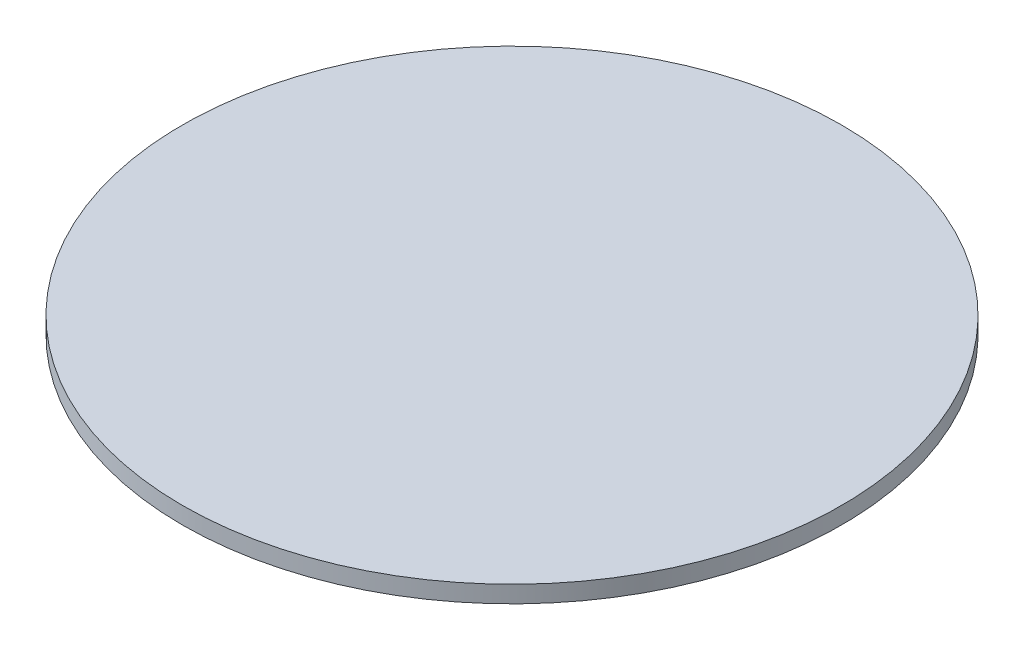
ISO-10303-21;
HEADER;
FILE_DESCRIPTION(('STEP AP214'),'2;1');
FILE_NAME('part.step','',(''),(''),'','','');
FILE_SCHEMA(('AUTOMOTIVE_DESIGN { 1 0 10303 214 1 1 1 1 }'));
ENDSEC;
DATA;
#1=APPLICATION_CONTEXT('core data for automotive mechanical design processes');
#2=APPLICATION_PROTOCOL_DEFINITION('international standard','automotive_design',2000,#1);
#3=PRODUCT_CONTEXT('',#1,'mechanical');
#4=PRODUCT('Part','Part','',(#3));
#5=PRODUCT_RELATED_PRODUCT_CATEGORY('part','',(#4));
#6=PRODUCT_DEFINITION_FORMATION('','',#4);
#7=PRODUCT_DEFINITION_CONTEXT('part definition',#1,'design');
#8=PRODUCT_DEFINITION('design','',#6,#7);
#9=PRODUCT_DEFINITION_SHAPE('','',#8);
#10=(LENGTH_UNIT() NAMED_UNIT(*) SI_UNIT(.MILLI.,.METRE.));
#11=(NAMED_UNIT(*) PLANE_ANGLE_UNIT() SI_UNIT($,.RADIAN.));
#12=(NAMED_UNIT(*) SI_UNIT($,.STERADIAN.) SOLID_ANGLE_UNIT());
#13=UNCERTAINTY_MEASURE_WITH_UNIT(LENGTH_MEASURE(1.E-05),#10,'distance_accuracy_value','');
#14=(GEOMETRIC_REPRESENTATION_CONTEXT(3) GLOBAL_UNCERTAINTY_ASSIGNED_CONTEXT((#13)) GLOBAL_UNIT_ASSIGNED_CONTEXT((#10,
#11,#12)) REPRESENTATION_CONTEXT('',''));
#15=CARTESIAN_POINT('',(0.,0.,0.));
#16=DIRECTION('',(0.,0.,1.));
#17=DIRECTION('',(1.,0.,0.));
#18=AXIS2_PLACEMENT_3D('',#15,#16,#17);
#19=CARTESIAN_POINT('',(0.,2.,0.));
#20=DIRECTION('',(0.,-1.,0.));
#21=DIRECTION('',(0.,0.,-1.));
#22=AXIS2_PLACEMENT_3D('',#19,#20,#21);
#23=CYLINDRICAL_SURFACE('',#22,38.8);
#24=CARTESIAN_POINT('',(0.,2.,0.));
#25=DIRECTION('',(0.,1.,0.));
#26=DIRECTION('',(0.,0.,1.));
#27=AXIS2_PLACEMENT_3D('',#24,#25,#26);
#28=CIRCLE('',#27,38.8);
#29=CARTESIAN_POINT('',(0.,2.,38.8));
#30=VERTEX_POINT('',#29);
#31=EDGE_CURVE('E10',#30,#30,#28,.T.);
#32=ORIENTED_EDGE('',*,*,#31,.F.);
#33=EDGE_LOOP('',(#32));
#34=FACE_BOUND('',#33,.T.);
#35=CARTESIAN_POINT('',(0.,0.,0.));
#36=DIRECTION('',(0.,1.,0.));
#37=DIRECTION('',(0.,0.,1.));
#38=AXIS2_PLACEMENT_3D('',#35,#36,#37);
#39=CIRCLE('',#38,38.8);
#40=CARTESIAN_POINT('',(0.,0.,38.8));
#41=VERTEX_POINT('',#40);
#42=EDGE_CURVE('E40',#41,#41,#39,.T.);
#43=ORIENTED_EDGE('',*,*,#42,.T.);
#44=EDGE_LOOP('',(#43));
#45=FACE_BOUND('',#44,.T.);
#46=ADVANCED_FACE('F37',(#34,#45),#23,.T.);
#47=CARTESIAN_POINT('',(0.,2.,0.));
#48=DIRECTION('',(0.,1.,0.));
#49=DIRECTION('',(0.,0.,1.));
#50=AXIS2_PLACEMENT_3D('',#47,#48,#49);
#51=PLANE('',#50);
#52=ORIENTED_EDGE('',*,*,#31,.T.);
#53=EDGE_LOOP('',(#52));
#54=FACE_BOUND('',#53,.T.);
#55=ADVANCED_FACE('F54',(#54),#51,.T.);
#56=CARTESIAN_POINT('',(0.,0.,0.));
#57=DIRECTION('',(0.,1.,0.));
#58=DIRECTION('',(0.,0.,1.));
#59=AXIS2_PLACEMENT_3D('',#56,#57,#58);
#60=PLANE('',#59);
#61=ORIENTED_EDGE('',*,*,#42,.F.);
#62=EDGE_LOOP('',(#61));
#63=FACE_BOUND('',#62,.T.);
#64=ADVANCED_FACE('F52',(#63),#60,.F.);
#65=CLOSED_SHELL('',(#46,#55,#64));
#66=MANIFOLD_SOLID_BREP('B2',#65);
#67=ADVANCED_BREP_SHAPE_REPRESENTATION('',(#18,#66),#14);
#68=SHAPE_DEFINITION_REPRESENTATION(#9,#67);
ENDSEC;
END-ISO-10303-21;
